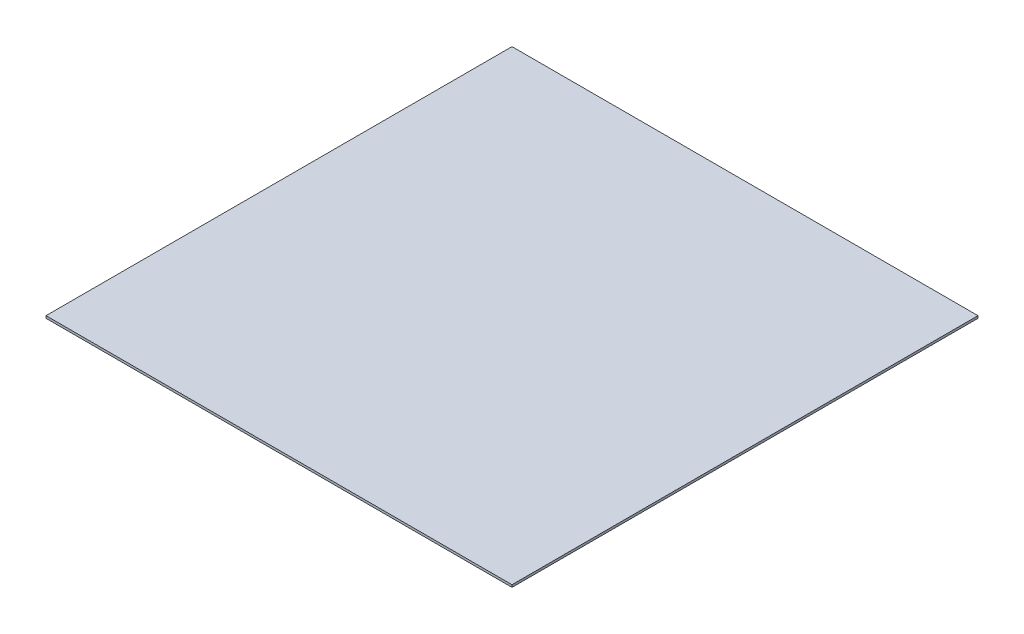
ISO-10303-21;
HEADER;
FILE_DESCRIPTION(('STEP AP214'),'2;1');
FILE_NAME('part.step','',(''),(''),'','','');
FILE_SCHEMA(('AUTOMOTIVE_DESIGN { 1 0 10303 214 1 1 1 1 }'));
ENDSEC;
DATA;
#1=APPLICATION_CONTEXT('core data for automotive mechanical design processes');
#2=APPLICATION_PROTOCOL_DEFINITION('international standard','automotive_design',2000,#1);
#3=PRODUCT_CONTEXT('',#1,'mechanical');
#4=PRODUCT('Part','Part','',(#3));
#5=PRODUCT_RELATED_PRODUCT_CATEGORY('part','',(#4));
#6=PRODUCT_DEFINITION_FORMATION('','',#4);
#7=PRODUCT_DEFINITION_CONTEXT('part definition',#1,'design');
#8=PRODUCT_DEFINITION('design','',#6,#7);
#9=PRODUCT_DEFINITION_SHAPE('','',#8);
#10=(LENGTH_UNIT() NAMED_UNIT(*) SI_UNIT(.MILLI.,.METRE.));
#11=(NAMED_UNIT(*) PLANE_ANGLE_UNIT() SI_UNIT($,.RADIAN.));
#12=(NAMED_UNIT(*) SI_UNIT($,.STERADIAN.) SOLID_ANGLE_UNIT());
#13=UNCERTAINTY_MEASURE_WITH_UNIT(LENGTH_MEASURE(1.E-05),#10,'distance_accuracy_value','');
#14=(GEOMETRIC_REPRESENTATION_CONTEXT(3) GLOBAL_UNCERTAINTY_ASSIGNED_CONTEXT((#13)) GLOBAL_UNIT_ASSIGNED_CONTEXT((#10,
#11,#12)) REPRESENTATION_CONTEXT('',''));
#15=CARTESIAN_POINT('',(0.,0.,0.));
#16=DIRECTION('',(0.,0.,1.));
#17=DIRECTION('',(1.,0.,0.));
#18=AXIS2_PLACEMENT_3D('',#15,#16,#17);
#19=CARTESIAN_POINT('',(10000.,100.,-10000.));
#20=DIRECTION('',(-1.,0.,0.));
#21=DIRECTION('',(0.,0.,1.));
#22=AXIS2_PLACEMENT_3D('',#19,#20,#21);
#23=PLANE('',#22);
#24=DIRECTION('',(0.,0.,-1.));
#25=VECTOR('',#24,1.);
#26=CARTESIAN_POINT('',(10000.,0.,-10000.));
#27=LINE('',#26,#25);
#28=CARTESIAN_POINT('',(10000.,0.,10000.));
#29=VERTEX_POINT('',#28);
#30=CARTESIAN_POINT('',(10000.,0.,-10000.));
#31=VERTEX_POINT('',#30);
#32=EDGE_CURVE('E107',#29,#31,#27,.T.);
#33=ORIENTED_EDGE('',*,*,#32,.T.);
#34=DIRECTION('',(0.,-1.,0.));
#35=VECTOR('',#34,1.);
#36=CARTESIAN_POINT('',(10000.,100.,-10000.));
#37=LINE('',#36,#35);
#38=CARTESIAN_POINT('',(10000.,100.,-10000.));
#39=VERTEX_POINT('',#38);
#40=EDGE_CURVE('E11',#39,#31,#37,.T.);
#41=ORIENTED_EDGE('',*,*,#40,.F.);
#42=DIRECTION('',(0.,0.,-1.));
#43=VECTOR('',#42,1.);
#44=CARTESIAN_POINT('',(10000.,100.,-10000.));
#45=LINE('',#44,#43);
#46=CARTESIAN_POINT('',(10000.,100.,10000.));
#47=VERTEX_POINT('',#46);
#48=EDGE_CURVE('E91',#47,#39,#45,.T.);
#49=ORIENTED_EDGE('',*,*,#48,.F.);
#50=DIRECTION('',(0.,-1.,0.));
#51=VECTOR('',#50,1.);
#52=CARTESIAN_POINT('',(10000.,100.,10000.));
#53=LINE('',#52,#51);
#54=EDGE_CURVE('E103',#47,#29,#53,.T.);
#55=ORIENTED_EDGE('',*,*,#54,.T.);
#56=EDGE_LOOP('',(#33,#41,#49,#55));
#57=FACE_BOUND('',#56,.T.);
#58=ADVANCED_FACE('F39',(#57),#23,.F.);
#59=CARTESIAN_POINT('',(-10000.,100.,-10000.));
#60=DIRECTION('',(0.,0.,1.));
#61=DIRECTION('',(1.,0.,0.));
#62=AXIS2_PLACEMENT_3D('',#59,#60,#61);
#63=PLANE('',#62);
#64=DIRECTION('',(-1.,0.,0.));
#65=VECTOR('',#64,1.);
#66=CARTESIAN_POINT('',(-10000.,0.,-10000.));
#67=LINE('',#66,#65);
#68=CARTESIAN_POINT('',(-10000.,0.,-10000.));
#69=VERTEX_POINT('',#68);
#70=EDGE_CURVE('E96',#31,#69,#67,.T.);
#71=ORIENTED_EDGE('',*,*,#70,.T.);
#72=DIRECTION('',(0.,-1.,0.));
#73=VECTOR('',#72,1.);
#74=CARTESIAN_POINT('',(-10000.,100.,-10000.));
#75=LINE('',#74,#73);
#76=CARTESIAN_POINT('',(-10000.,100.,-10000.));
#77=VERTEX_POINT('',#76);
#78=EDGE_CURVE('E48',#77,#69,#75,.T.);
#79=ORIENTED_EDGE('',*,*,#78,.F.);
#80=DIRECTION('',(-1.,0.,0.));
#81=VECTOR('',#80,1.);
#82=CARTESIAN_POINT('',(-10000.,100.,-10000.));
#83=LINE('',#82,#81);
#84=EDGE_CURVE('E86',#39,#77,#83,.T.);
#85=ORIENTED_EDGE('',*,*,#84,.F.);
#86=ORIENTED_EDGE('',*,*,#40,.T.);
#87=EDGE_LOOP('',(#71,#79,#85,#86));
#88=FACE_BOUND('',#87,.T.);
#89=ADVANCED_FACE('F95',(#88),#63,.F.);
#90=CARTESIAN_POINT('',(-10000.,100.,-10000.));
#91=DIRECTION('',(1.,0.,0.));
#92=DIRECTION('',(0.,0.,-1.));
#93=AXIS2_PLACEMENT_3D('',#90,#91,#92);
#94=PLANE('',#93);
#95=DIRECTION('',(0.,0.,1.));
#96=VECTOR('',#95,1.);
#97=CARTESIAN_POINT('',(-10000.,0.,-10000.));
#98=LINE('',#97,#96);
#99=CARTESIAN_POINT('',(-10000.,0.,10000.));
#100=VERTEX_POINT('',#99);
#101=EDGE_CURVE('E73',#69,#100,#98,.T.);
#102=ORIENTED_EDGE('',*,*,#101,.T.);
#103=DIRECTION('',(0.,-1.,0.));
#104=VECTOR('',#103,1.);
#105=CARTESIAN_POINT('',(-10000.,100.,10000.));
#106=LINE('',#105,#104);
#107=CARTESIAN_POINT('',(-10000.,100.,10000.));
#108=VERTEX_POINT('',#107);
#109=EDGE_CURVE('E98',#108,#100,#106,.T.);
#110=ORIENTED_EDGE('',*,*,#109,.F.);
#111=DIRECTION('',(0.,0.,1.));
#112=VECTOR('',#111,1.);
#113=CARTESIAN_POINT('',(-10000.,100.,-10000.));
#114=LINE('',#113,#112);
#115=EDGE_CURVE('E89',#77,#108,#114,.T.);
#116=ORIENTED_EDGE('',*,*,#115,.F.);
#117=ORIENTED_EDGE('',*,*,#78,.T.);
#118=EDGE_LOOP('',(#102,#110,#116,#117));
#119=FACE_BOUND('',#118,.T.);
#120=ADVANCED_FACE('F99',(#119),#94,.F.);
#121=CARTESIAN_POINT('',(-10000.,100.,10000.));
#122=DIRECTION('',(0.,0.,-1.));
#123=DIRECTION('',(-1.,0.,0.));
#124=AXIS2_PLACEMENT_3D('',#121,#122,#123);
#125=PLANE('',#124);
#126=DIRECTION('',(1.,0.,0.));
#127=VECTOR('',#126,1.);
#128=CARTESIAN_POINT('',(-10000.,0.,10000.));
#129=LINE('',#128,#127);
#130=EDGE_CURVE('E79',#100,#29,#129,.T.);
#131=ORIENTED_EDGE('',*,*,#130,.T.);
#132=ORIENTED_EDGE('',*,*,#54,.F.);
#133=DIRECTION('',(1.,0.,0.));
#134=VECTOR('',#133,1.);
#135=CARTESIAN_POINT('',(-10000.,100.,10000.));
#136=LINE('',#135,#134);
#137=EDGE_CURVE('E56',#108,#47,#136,.T.);
#138=ORIENTED_EDGE('',*,*,#137,.F.);
#139=ORIENTED_EDGE('',*,*,#109,.T.);
#140=EDGE_LOOP('',(#131,#132,#138,#139));
#141=FACE_BOUND('',#140,.T.);
#142=ADVANCED_FACE('F120',(#141),#125,.F.);
#143=CARTESIAN_POINT('',(0.,100.,0.));
#144=DIRECTION('',(0.,1.,0.));
#145=DIRECTION('',(0.,0.,1.));
#146=AXIS2_PLACEMENT_3D('',#143,#144,#145);
#147=PLANE('',#146);
#148=ORIENTED_EDGE('',*,*,#48,.T.);
#149=ORIENTED_EDGE('',*,*,#84,.T.);
#150=ORIENTED_EDGE('',*,*,#115,.T.);
#151=ORIENTED_EDGE('',*,*,#137,.T.);
#152=EDGE_LOOP('',(#148,#149,#150,#151));
#153=FACE_BOUND('',#152,.T.);
#154=ADVANCED_FACE('F87',(#153),#147,.T.);
#155=CARTESIAN_POINT('',(0.,0.,0.));
#156=DIRECTION('',(0.,1.,0.));
#157=DIRECTION('',(0.,0.,1.));
#158=AXIS2_PLACEMENT_3D('',#155,#156,#157);
#159=PLANE('',#158);
#160=ORIENTED_EDGE('',*,*,#32,.F.);
#161=ORIENTED_EDGE('',*,*,#130,.F.);
#162=ORIENTED_EDGE('',*,*,#101,.F.);
#163=ORIENTED_EDGE('',*,*,#70,.F.);
#164=EDGE_LOOP('',(#160,#161,#162,#163));
#165=FACE_BOUND('',#164,.T.);
#166=ADVANCED_FACE('F123',(#165),#159,.F.);
#167=CLOSED_SHELL('',(#58,#89,#120,#142,#154,#166));
#168=MANIFOLD_SOLID_BREP('B2',#167);
#169=ADVANCED_BREP_SHAPE_REPRESENTATION('',(#18,#168),#14);
#170=SHAPE_DEFINITION_REPRESENTATION(#9,#169);
ENDSEC;
END-ISO-10303-21;
